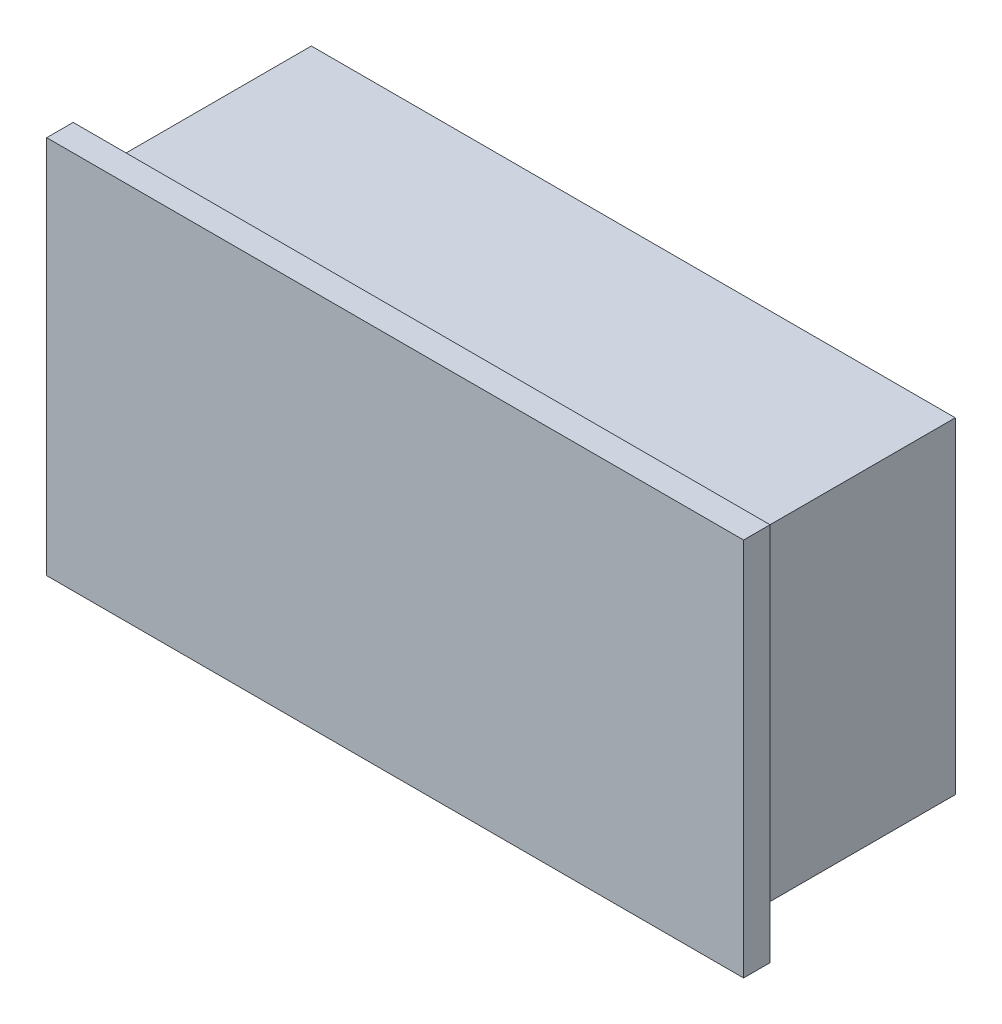
ISO-10303-21;
HEADER;
FILE_DESCRIPTION(('STEP AP214'),'2;1');
FILE_NAME('part.step','',(''),(''),'','','');
FILE_SCHEMA(('AUTOMOTIVE_DESIGN { 1 0 10303 214 1 1 1 1 }'));
ENDSEC;
DATA;
#1=APPLICATION_CONTEXT('core data for automotive mechanical design processes');
#2=APPLICATION_PROTOCOL_DEFINITION('international standard','automotive_design',2000,#1);
#3=PRODUCT_CONTEXT('',#1,'mechanical');
#4=PRODUCT('Part','Part','',(#3));
#5=PRODUCT_RELATED_PRODUCT_CATEGORY('part','',(#4));
#6=PRODUCT_DEFINITION_FORMATION('','',#4);
#7=PRODUCT_DEFINITION_CONTEXT('part definition',#1,'design');
#8=PRODUCT_DEFINITION('design','',#6,#7);
#9=PRODUCT_DEFINITION_SHAPE('','',#8);
#10=(LENGTH_UNIT() NAMED_UNIT(*) SI_UNIT(.MILLI.,.METRE.));
#11=(NAMED_UNIT(*) PLANE_ANGLE_UNIT() SI_UNIT($,.RADIAN.));
#12=(NAMED_UNIT(*) SI_UNIT($,.STERADIAN.) SOLID_ANGLE_UNIT());
#13=UNCERTAINTY_MEASURE_WITH_UNIT(LENGTH_MEASURE(1.E-05),#10,'distance_accuracy_value','');
#14=(GEOMETRIC_REPRESENTATION_CONTEXT(3) GLOBAL_UNCERTAINTY_ASSIGNED_CONTEXT((#13)) GLOBAL_UNIT_ASSIGNED_CONTEXT((#10,
#11,#12)) REPRESENTATION_CONTEXT('',''));
#15=CARTESIAN_POINT('',(0.,0.,0.));
#16=DIRECTION('',(0.,0.,1.));
#17=DIRECTION('',(1.,0.,0.));
#18=AXIS2_PLACEMENT_3D('',#15,#16,#17);
#19=CARTESIAN_POINT('',(39.5,21.5,27.));
#20=DIRECTION('',(-1.,0.,0.));
#21=DIRECTION('',(0.,-1.,0.));
#22=AXIS2_PLACEMENT_3D('',#19,#20,#21);
#23=PLANE('',#22);
#24=DIRECTION('',(0.,0.,-1.));
#25=VECTOR('',#24,1.);
#26=CARTESIAN_POINT('',(39.5,-21.5,27.));
#27=LINE('',#26,#25);
#28=CARTESIAN_POINT('',(39.5,-21.5,27.));
#29=VERTEX_POINT('',#28);
#30=CARTESIAN_POINT('',(39.5,-21.5,24.));
#31=VERTEX_POINT('',#30);
#32=EDGE_CURVE('E121',#29,#31,#27,.T.);
#33=ORIENTED_EDGE('',*,*,#32,.T.);
#34=DIRECTION('',(0.,-1.,0.));
#35=VECTOR('',#34,1.);
#36=CARTESIAN_POINT('',(39.5,-21.5,24.));
#37=LINE('',#36,#35);
#38=CARTESIAN_POINT('',(39.5,21.5,24.));
#39=VERTEX_POINT('',#38);
#40=EDGE_CURVE('E50',#39,#31,#37,.T.);
#41=ORIENTED_EDGE('',*,*,#40,.F.);
#42=DIRECTION('',(0.,0.,-1.));
#43=VECTOR('',#42,1.);
#44=CARTESIAN_POINT('',(39.5,21.5,27.));
#45=LINE('',#44,#43);
#46=CARTESIAN_POINT('',(39.5,21.5,27.));
#47=VERTEX_POINT('',#46);
#48=EDGE_CURVE('E12',#47,#39,#45,.T.);
#49=ORIENTED_EDGE('',*,*,#48,.F.);
#50=DIRECTION('',(0.,1.,0.));
#51=VECTOR('',#50,1.);
#52=CARTESIAN_POINT('',(39.5,21.5,27.));
#53=LINE('',#52,#51);
#54=EDGE_CURVE('E130',#29,#47,#53,.T.);
#55=ORIENTED_EDGE('',*,*,#54,.F.);
#56=EDGE_LOOP('',(#33,#41,#49,#55));
#57=FACE_BOUND('',#56,.T.);
#58=ADVANCED_FACE('F36',(#57),#23,.F.);
#59=CARTESIAN_POINT('',(-39.5,21.5,27.));
#60=DIRECTION('',(0.,-1.,0.));
#61=DIRECTION('',(0.,0.,-1.));
#62=AXIS2_PLACEMENT_3D('',#59,#60,#61);
#63=PLANE('',#62);
#64=ORIENTED_EDGE('',*,*,#48,.T.);
#65=DIRECTION('',(1.,0.,0.));
#66=VECTOR('',#65,1.);
#67=CARTESIAN_POINT('',(-39.5,21.5,24.));
#68=LINE('',#67,#66);
#69=CARTESIAN_POINT('',(-39.5,21.5,24.));
#70=VERTEX_POINT('',#69);
#71=EDGE_CURVE('E117',#70,#39,#68,.T.);
#72=ORIENTED_EDGE('',*,*,#71,.F.);
#73=DIRECTION('',(0.,0.,-1.));
#74=VECTOR('',#73,1.);
#75=CARTESIAN_POINT('',(-39.5,21.5,27.));
#76=LINE('',#75,#74);
#77=CARTESIAN_POINT('',(-39.5,21.5,27.));
#78=VERTEX_POINT('',#77);
#79=EDGE_CURVE('E43',#78,#70,#76,.T.);
#80=ORIENTED_EDGE('',*,*,#79,.F.);
#81=DIRECTION('',(-1.,0.,0.));
#82=VECTOR('',#81,1.);
#83=CARTESIAN_POINT('',(-39.5,21.5,27.));
#84=LINE('',#83,#82);
#85=EDGE_CURVE('E128',#47,#78,#84,.T.);
#86=ORIENTED_EDGE('',*,*,#85,.F.);
#87=EDGE_LOOP('',(#64,#72,#80,#86));
#88=FACE_BOUND('',#87,.T.);
#89=ADVANCED_FACE('F190',(#88),#63,.F.);
#90=CARTESIAN_POINT('',(-39.5,21.5,27.));
#91=DIRECTION('',(1.,0.,0.));
#92=DIRECTION('',(0.,0.,-1.));
#93=AXIS2_PLACEMENT_3D('',#90,#91,#92);
#94=PLANE('',#93);
#95=ORIENTED_EDGE('',*,*,#79,.T.);
#96=DIRECTION('',(0.,1.,0.));
#97=VECTOR('',#96,1.);
#98=CARTESIAN_POINT('',(-39.5,-21.5,24.));
#99=LINE('',#98,#97);
#100=CARTESIAN_POINT('',(-39.5,-21.5,24.));
#101=VERTEX_POINT('',#100);
#102=EDGE_CURVE('E101',#101,#70,#99,.T.);
#103=ORIENTED_EDGE('',*,*,#102,.F.);
#104=DIRECTION('',(0.,0.,-1.));
#105=VECTOR('',#104,1.);
#106=CARTESIAN_POINT('',(-39.5,-21.5,27.));
#107=LINE('',#106,#105);
#108=CARTESIAN_POINT('',(-39.5,-21.5,27.));
#109=VERTEX_POINT('',#108);
#110=EDGE_CURVE('E114',#109,#101,#107,.T.);
#111=ORIENTED_EDGE('',*,*,#110,.F.);
#112=DIRECTION('',(0.,-1.,0.));
#113=VECTOR('',#112,1.);
#114=CARTESIAN_POINT('',(-39.5,21.5,27.));
#115=LINE('',#114,#113);
#116=EDGE_CURVE('E126',#78,#109,#115,.T.);
#117=ORIENTED_EDGE('',*,*,#116,.F.);
#118=EDGE_LOOP('',(#95,#103,#111,#117));
#119=FACE_BOUND('',#118,.T.);
#120=ADVANCED_FACE('F112',(#119),#94,.F.);
#121=CARTESIAN_POINT('',(-39.5,-21.5,27.));
#122=DIRECTION('',(0.,1.,0.));
#123=DIRECTION('',(0.,0.,1.));
#124=AXIS2_PLACEMENT_3D('',#121,#122,#123);
#125=PLANE('',#124);
#126=ORIENTED_EDGE('',*,*,#110,.T.);
#127=DIRECTION('',(-1.,0.,0.));
#128=VECTOR('',#127,1.);
#129=CARTESIAN_POINT('',(-39.5,-21.5,24.));
#130=LINE('',#129,#128);
#131=EDGE_CURVE('E97',#31,#101,#130,.T.);
#132=ORIENTED_EDGE('',*,*,#131,.F.);
#133=ORIENTED_EDGE('',*,*,#32,.F.);
#134=DIRECTION('',(1.,0.,0.));
#135=VECTOR('',#134,1.);
#136=CARTESIAN_POINT('',(-39.5,-21.5,27.));
#137=LINE('',#136,#135);
#138=EDGE_CURVE('E120',#109,#29,#137,.T.);
#139=ORIENTED_EDGE('',*,*,#138,.F.);
#140=EDGE_LOOP('',(#126,#132,#133,#139));
#141=FACE_BOUND('',#140,.T.);
#142=ADVANCED_FACE('F119',(#141),#125,.F.);
#143=CARTESIAN_POINT('',(0.,0.,27.));
#144=DIRECTION('',(0.,0.,1.));
#145=DIRECTION('',(1.,0.,0.));
#146=AXIS2_PLACEMENT_3D('',#143,#144,#145);
#147=PLANE('',#146);
#148=ORIENTED_EDGE('',*,*,#54,.T.);
#149=ORIENTED_EDGE('',*,*,#85,.T.);
#150=ORIENTED_EDGE('',*,*,#116,.T.);
#151=ORIENTED_EDGE('',*,*,#138,.T.);
#152=EDGE_LOOP('',(#148,#149,#150,#151));
#153=FACE_BOUND('',#152,.T.);
#154=ADVANCED_FACE('F199',(#153),#147,.T.);
#155=CARTESIAN_POINT('',(36.5,18.5,116.944427287075));
#156=DIRECTION('',(1.,0.,0.));
#157=DIRECTION('',(0.,0.,-1.));
#158=AXIS2_PLACEMENT_3D('',#155,#156,#157);
#159=PLANE('',#158);
#160=DIRECTION('',(0.,-1.,0.));
#161=VECTOR('',#160,1.);
#162=CARTESIAN_POINT('',(36.5,18.5,24.));
#163=LINE('',#162,#161);
#164=CARTESIAN_POINT('',(36.5,18.5,24.));
#165=VERTEX_POINT('',#164);
#166=CARTESIAN_POINT('',(36.5,-18.5,24.));
#167=VERTEX_POINT('',#166);
#168=EDGE_CURVE('E146',#165,#167,#163,.T.);
#169=ORIENTED_EDGE('',*,*,#168,.T.);
#170=DIRECTION('',(0.,0.,-1.));
#171=VECTOR('',#170,1.);
#172=CARTESIAN_POINT('',(36.5,-18.5,116.944427287075));
#173=LINE('',#172,#171);
#174=CARTESIAN_POINT('',(36.5,-18.5,0.));
#175=VERTEX_POINT('',#174);
#176=EDGE_CURVE('E134',#167,#175,#173,.T.);
#177=ORIENTED_EDGE('',*,*,#176,.T.);
#178=DIRECTION('',(0.,-1.,0.));
#179=VECTOR('',#178,1.);
#180=CARTESIAN_POINT('',(36.5,18.5,0.));
#181=LINE('',#180,#179);
#182=CARTESIAN_POINT('',(36.5,18.5,0.));
#183=VERTEX_POINT('',#182);
#184=EDGE_CURVE('E142',#183,#175,#181,.T.);
#185=ORIENTED_EDGE('',*,*,#184,.F.);
#186=DIRECTION('',(0.,0.,-1.));
#187=VECTOR('',#186,1.);
#188=CARTESIAN_POINT('',(36.5,18.5,116.944427287075));
#189=LINE('',#188,#187);
#190=EDGE_CURVE('E107',#165,#183,#189,.T.);
#191=ORIENTED_EDGE('',*,*,#190,.F.);
#192=EDGE_LOOP('',(#169,#177,#185,#191));
#193=FACE_BOUND('',#192,.T.);
#194=ADVANCED_FACE('F172',(#193),#159,.T.);
#195=CARTESIAN_POINT('',(-36.5,18.5,116.944427287075));
#196=DIRECTION('',(0.,1.,0.));
#197=DIRECTION('',(0.,0.,1.));
#198=AXIS2_PLACEMENT_3D('',#195,#196,#197);
#199=PLANE('',#198);
#200=DIRECTION('',(1.,0.,0.));
#201=VECTOR('',#200,1.);
#202=CARTESIAN_POINT('',(-36.5,18.5,24.));
#203=LINE('',#202,#201);
#204=CARTESIAN_POINT('',(-36.5,18.5,24.));
#205=VERTEX_POINT('',#204);
#206=EDGE_CURVE('E152',#205,#165,#203,.T.);
#207=ORIENTED_EDGE('',*,*,#206,.T.);
#208=ORIENTED_EDGE('',*,*,#190,.T.);
#209=DIRECTION('',(1.,0.,0.));
#210=VECTOR('',#209,1.);
#211=CARTESIAN_POINT('',(-36.5,18.5,0.));
#212=LINE('',#211,#210);
#213=CARTESIAN_POINT('',(-36.5,18.5,0.));
#214=VERTEX_POINT('',#213);
#215=EDGE_CURVE('E139',#214,#183,#212,.T.);
#216=ORIENTED_EDGE('',*,*,#215,.F.);
#217=DIRECTION('',(0.,0.,-1.));
#218=VECTOR('',#217,1.);
#219=CARTESIAN_POINT('',(-36.5,18.5,116.944427287075));
#220=LINE('',#219,#218);
#221=EDGE_CURVE('E140',#205,#214,#220,.T.);
#222=ORIENTED_EDGE('',*,*,#221,.F.);
#223=EDGE_LOOP('',(#207,#208,#216,#222));
#224=FACE_BOUND('',#223,.T.);
#225=ADVANCED_FACE('F169',(#224),#199,.T.);
#226=CARTESIAN_POINT('',(-36.5,18.5,116.944427287075));
#227=DIRECTION('',(-1.,0.,0.));
#228=DIRECTION('',(0.,0.,1.));
#229=AXIS2_PLACEMENT_3D('',#226,#227,#228);
#230=PLANE('',#229);
#231=DIRECTION('',(0.,1.,0.));
#232=VECTOR('',#231,1.);
#233=CARTESIAN_POINT('',(-36.5,18.5,24.));
#234=LINE('',#233,#232);
#235=CARTESIAN_POINT('',(-36.5,-18.5,24.));
#236=VERTEX_POINT('',#235);
#237=EDGE_CURVE('E133',#236,#205,#234,.T.);
#238=ORIENTED_EDGE('',*,*,#237,.T.);
#239=ORIENTED_EDGE('',*,*,#221,.T.);
#240=DIRECTION('',(0.,1.,0.));
#241=VECTOR('',#240,1.);
#242=CARTESIAN_POINT('',(-36.5,18.5,0.));
#243=LINE('',#242,#241);
#244=CARTESIAN_POINT('',(-36.5,-18.5,0.));
#245=VERTEX_POINT('',#244);
#246=EDGE_CURVE('E58',#245,#214,#243,.T.);
#247=ORIENTED_EDGE('',*,*,#246,.F.);
#248=DIRECTION('',(0.,0.,-1.));
#249=VECTOR('',#248,1.);
#250=CARTESIAN_POINT('',(-36.5,-18.5,116.944427287075));
#251=LINE('',#250,#249);
#252=EDGE_CURVE('E137',#236,#245,#251,.T.);
#253=ORIENTED_EDGE('',*,*,#252,.F.);
#254=EDGE_LOOP('',(#238,#239,#247,#253));
#255=FACE_BOUND('',#254,.T.);
#256=ADVANCED_FACE('F178',(#255),#230,.T.);
#257=CARTESIAN_POINT('',(-36.5,-18.5,116.944427287075));
#258=DIRECTION('',(0.,-1.,0.));
#259=DIRECTION('',(0.,0.,-1.));
#260=AXIS2_PLACEMENT_3D('',#257,#258,#259);
#261=PLANE('',#260);
#262=DIRECTION('',(-1.,0.,0.));
#263=VECTOR('',#262,1.);
#264=CARTESIAN_POINT('',(-36.5,-18.5,24.));
#265=LINE('',#264,#263);
#266=EDGE_CURVE('E144',#167,#236,#265,.T.);
#267=ORIENTED_EDGE('',*,*,#266,.T.);
#268=ORIENTED_EDGE('',*,*,#252,.T.);
#269=DIRECTION('',(-1.,0.,0.));
#270=VECTOR('',#269,1.);
#271=CARTESIAN_POINT('',(-36.5,-18.5,0.));
#272=LINE('',#271,#270);
#273=EDGE_CURVE('E136',#175,#245,#272,.T.);
#274=ORIENTED_EDGE('',*,*,#273,.F.);
#275=ORIENTED_EDGE('',*,*,#176,.F.);
#276=EDGE_LOOP('',(#267,#268,#274,#275));
#277=FACE_BOUND('',#276,.T.);
#278=ADVANCED_FACE('F176',(#277),#261,.T.);
#279=CARTESIAN_POINT('',(0.,0.,24.));
#280=DIRECTION('',(0.,0.,1.));
#281=DIRECTION('',(1.,0.,0.));
#282=AXIS2_PLACEMENT_3D('',#279,#280,#281);
#283=PLANE('',#282);
#284=ORIENTED_EDGE('',*,*,#40,.T.);
#285=ORIENTED_EDGE('',*,*,#131,.T.);
#286=ORIENTED_EDGE('',*,*,#102,.T.);
#287=ORIENTED_EDGE('',*,*,#71,.T.);
#288=EDGE_LOOP('',(#284,#285,#286,#287));
#289=FACE_BOUND('',#288,.T.);
#290=ORIENTED_EDGE('',*,*,#206,.F.);
#291=ORIENTED_EDGE('',*,*,#237,.F.);
#292=ORIENTED_EDGE('',*,*,#266,.F.);
#293=ORIENTED_EDGE('',*,*,#168,.F.);
#294=EDGE_LOOP('',(#290,#291,#292,#293));
#295=FACE_BOUND('',#294,.T.);
#296=ADVANCED_FACE('F99',(#289,#295),#283,.F.);
#297=CARTESIAN_POINT('',(0.,0.,0.));
#298=DIRECTION('',(0.,0.,1.));
#299=DIRECTION('',(1.,0.,0.));
#300=AXIS2_PLACEMENT_3D('',#297,#298,#299);
#301=PLANE('',#300);
#302=ORIENTED_EDGE('',*,*,#184,.T.);
#303=ORIENTED_EDGE('',*,*,#273,.T.);
#304=ORIENTED_EDGE('',*,*,#246,.T.);
#305=ORIENTED_EDGE('',*,*,#215,.T.);
#306=EDGE_LOOP('',(#302,#303,#304,#305));
#307=FACE_BOUND('',#306,.T.);
#308=ADVANCED_FACE('F165',(#307),#301,.F.);
#309=CLOSED_SHELL('',(#58,#89,#120,#142,#154,#194,#225,#256,#278,#296,#308));
#310=MANIFOLD_SOLID_BREP('B2',#309);
#311=ADVANCED_BREP_SHAPE_REPRESENTATION('',(#18,#310),#14);
#312=SHAPE_DEFINITION_REPRESENTATION(#9,#311);
ENDSEC;
END-ISO-10303-21;
